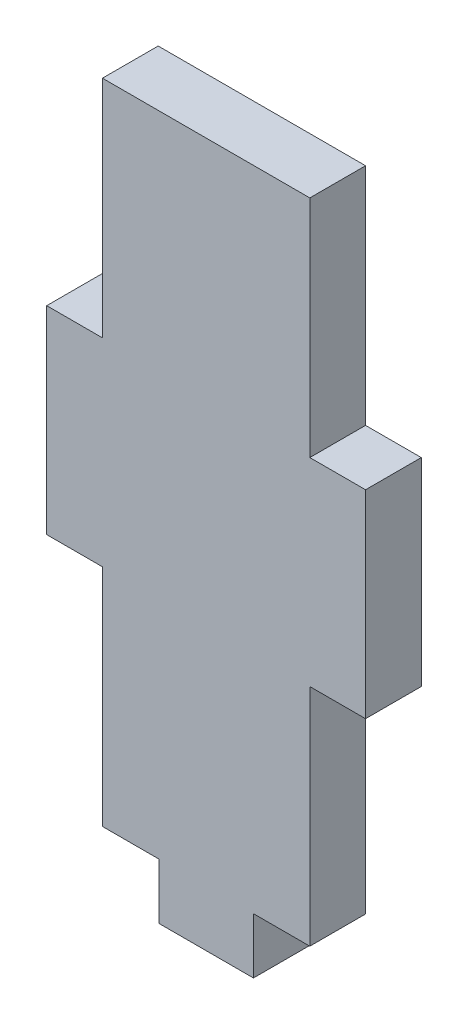
ISO-10303-21;
HEADER;
FILE_DESCRIPTION(('STEP AP214'),'2;1');
FILE_NAME('part.step','',(''),(''),'','','');
FILE_SCHEMA(('AUTOMOTIVE_DESIGN { 1 0 10303 214 1 1 1 1 }'));
ENDSEC;
DATA;
#1=APPLICATION_CONTEXT('core data for automotive mechanical design processes');
#2=APPLICATION_PROTOCOL_DEFINITION('international standard','automotive_design',2000,#1);
#3=PRODUCT_CONTEXT('',#1,'mechanical');
#4=PRODUCT('Part','Part','',(#3));
#5=PRODUCT_RELATED_PRODUCT_CATEGORY('part','',(#4));
#6=PRODUCT_DEFINITION_FORMATION('','',#4);
#7=PRODUCT_DEFINITION_CONTEXT('part definition',#1,'design');
#8=PRODUCT_DEFINITION('design','',#6,#7);
#9=PRODUCT_DEFINITION_SHAPE('','',#8);
#10=(LENGTH_UNIT() NAMED_UNIT(*) SI_UNIT(.MILLI.,.METRE.));
#11=(NAMED_UNIT(*) PLANE_ANGLE_UNIT() SI_UNIT($,.RADIAN.));
#12=(NAMED_UNIT(*) SI_UNIT($,.STERADIAN.) SOLID_ANGLE_UNIT());
#13=UNCERTAINTY_MEASURE_WITH_UNIT(LENGTH_MEASURE(1.E-05),#10,'distance_accuracy_value','');
#14=(GEOMETRIC_REPRESENTATION_CONTEXT(3) GLOBAL_UNCERTAINTY_ASSIGNED_CONTEXT((#13)) GLOBAL_UNIT_ASSIGNED_CONTEXT((#10,
#11,#12)) REPRESENTATION_CONTEXT('',''));
#15=CARTESIAN_POINT('',(0.,0.,0.));
#16=DIRECTION('',(0.,0.,1.));
#17=DIRECTION('',(1.,0.,0.));
#18=AXIS2_PLACEMENT_3D('',#15,#16,#17);
#19=CARTESIAN_POINT('',(-8.,25.,4.3));
#20=DIRECTION('',(0.,-1.,0.));
#21=DIRECTION('',(0.,0.,-1.));
#22=AXIS2_PLACEMENT_3D('',#19,#20,#21);
#23=PLANE('',#22);
#24=DIRECTION('',(-1.,0.,0.));
#25=VECTOR('',#24,1.);
#26=CARTESIAN_POINT('',(-8.,25.,0.));
#27=LINE('',#26,#25);
#28=CARTESIAN_POINT('',(8.,25.,0.));
#29=VERTEX_POINT('',#28);
#30=CARTESIAN_POINT('',(-8.,25.,0.));
#31=VERTEX_POINT('',#30);
#32=EDGE_CURVE('E180',#29,#31,#27,.T.);
#33=ORIENTED_EDGE('',*,*,#32,.T.);
#34=DIRECTION('',(0.,0.,-1.));
#35=VECTOR('',#34,1.);
#36=CARTESIAN_POINT('',(-8.,25.,4.3));
#37=LINE('',#36,#35);
#38=CARTESIAN_POINT('',(-8.,25.,4.3));
#39=VERTEX_POINT('',#38);
#40=EDGE_CURVE('E11',#39,#31,#37,.T.);
#41=ORIENTED_EDGE('',*,*,#40,.F.);
#42=DIRECTION('',(-1.,0.,0.));
#43=VECTOR('',#42,1.);
#44=CARTESIAN_POINT('',(-8.,25.,4.3));
#45=LINE('',#44,#43);
#46=CARTESIAN_POINT('',(8.,25.,4.3));
#47=VERTEX_POINT('',#46);
#48=EDGE_CURVE('E210',#47,#39,#45,.T.);
#49=ORIENTED_EDGE('',*,*,#48,.F.);
#50=DIRECTION('',(0.,0.,-1.));
#51=VECTOR('',#50,1.);
#52=CARTESIAN_POINT('',(8.,25.,4.3));
#53=LINE('',#52,#51);
#54=EDGE_CURVE('E176',#47,#29,#53,.T.);
#55=ORIENTED_EDGE('',*,*,#54,.T.);
#56=EDGE_LOOP('',(#33,#41,#49,#55));
#57=FACE_BOUND('',#56,.T.);
#58=ADVANCED_FACE('F36',(#57),#23,.F.);
#59=CARTESIAN_POINT('',(-8.,7.65,4.3));
#60=DIRECTION('',(1.,0.,0.));
#61=DIRECTION('',(0.,1.,0.));
#62=AXIS2_PLACEMENT_3D('',#59,#60,#61);
#63=PLANE('',#62);
#64=DIRECTION('',(0.,-1.,0.));
#65=VECTOR('',#64,1.);
#66=CARTESIAN_POINT('',(-8.,7.65,0.));
#67=LINE('',#66,#65);
#68=CARTESIAN_POINT('',(-8.,7.65,0.));
#69=VERTEX_POINT('',#68);
#70=EDGE_CURVE('E183',#31,#69,#67,.T.);
#71=ORIENTED_EDGE('',*,*,#70,.T.);
#72=DIRECTION('',(0.,0.,-1.));
#73=VECTOR('',#72,1.);
#74=CARTESIAN_POINT('',(-8.,7.65,4.3));
#75=LINE('',#74,#73);
#76=CARTESIAN_POINT('',(-8.,7.65,4.3));
#77=VERTEX_POINT('',#76);
#78=EDGE_CURVE('E44',#77,#69,#75,.T.);
#79=ORIENTED_EDGE('',*,*,#78,.F.);
#80=DIRECTION('',(0.,-1.,0.));
#81=VECTOR('',#80,1.);
#82=CARTESIAN_POINT('',(-8.,7.65,4.3));
#83=LINE('',#82,#81);
#84=EDGE_CURVE('E119',#39,#77,#83,.T.);
#85=ORIENTED_EDGE('',*,*,#84,.F.);
#86=ORIENTED_EDGE('',*,*,#40,.T.);
#87=EDGE_LOOP('',(#71,#79,#85,#86));
#88=FACE_BOUND('',#87,.T.);
#89=ADVANCED_FACE('F308',(#88),#63,.F.);
#90=CARTESIAN_POINT('',(-8.,7.65,4.3));
#91=DIRECTION('',(0.,-1.,0.));
#92=DIRECTION('',(0.,0.,-1.));
#93=AXIS2_PLACEMENT_3D('',#90,#91,#92);
#94=PLANE('',#93);
#95=DIRECTION('',(-1.,0.,0.));
#96=VECTOR('',#95,1.);
#97=CARTESIAN_POINT('',(-8.,7.65,0.));
#98=LINE('',#97,#96);
#99=CARTESIAN_POINT('',(-12.3,7.65,0.));
#100=VERTEX_POINT('',#99);
#101=EDGE_CURVE('E185',#69,#100,#98,.T.);
#102=ORIENTED_EDGE('',*,*,#101,.T.);
#103=DIRECTION('',(0.,0.,-1.));
#104=VECTOR('',#103,1.);
#105=CARTESIAN_POINT('',(-12.3,7.65,4.3));
#106=LINE('',#105,#104);
#107=CARTESIAN_POINT('',(-12.3,7.65,4.3));
#108=VERTEX_POINT('',#107);
#109=EDGE_CURVE('E241',#108,#100,#106,.T.);
#110=ORIENTED_EDGE('',*,*,#109,.F.);
#111=DIRECTION('',(-1.,0.,0.));
#112=VECTOR('',#111,1.);
#113=CARTESIAN_POINT('',(-8.,7.65,4.3));
#114=LINE('',#113,#112);
#115=EDGE_CURVE('E249',#77,#108,#114,.T.);
#116=ORIENTED_EDGE('',*,*,#115,.F.);
#117=ORIENTED_EDGE('',*,*,#78,.T.);
#118=EDGE_LOOP('',(#102,#110,#116,#117));
#119=FACE_BOUND('',#118,.T.);
#120=ADVANCED_FACE('F247',(#119),#94,.F.);
#121=CARTESIAN_POINT('',(-12.3,-7.65,4.3));
#122=DIRECTION('',(1.,0.,0.));
#123=DIRECTION('',(0.,0.,-1.));
#124=AXIS2_PLACEMENT_3D('',#121,#122,#123);
#125=PLANE('',#124);
#126=DIRECTION('',(0.,-1.,0.));
#127=VECTOR('',#126,1.);
#128=CARTESIAN_POINT('',(-12.3,-7.65,0.));
#129=LINE('',#128,#127);
#130=CARTESIAN_POINT('',(-12.3,-7.65,0.));
#131=VERTEX_POINT('',#130);
#132=EDGE_CURVE('E187',#100,#131,#129,.T.);
#133=ORIENTED_EDGE('',*,*,#132,.T.);
#134=DIRECTION('',(0.,0.,-1.));
#135=VECTOR('',#134,1.);
#136=CARTESIAN_POINT('',(-12.3,-7.65,4.3));
#137=LINE('',#136,#135);
#138=CARTESIAN_POINT('',(-12.3,-7.65,4.3));
#139=VERTEX_POINT('',#138);
#140=EDGE_CURVE('E238',#139,#131,#137,.T.);
#141=ORIENTED_EDGE('',*,*,#140,.F.);
#142=DIRECTION('',(0.,-1.,0.));
#143=VECTOR('',#142,1.);
#144=CARTESIAN_POINT('',(-12.3,-7.65,4.3));
#145=LINE('',#144,#143);
#146=EDGE_CURVE('E267',#108,#139,#145,.T.);
#147=ORIENTED_EDGE('',*,*,#146,.F.);
#148=ORIENTED_EDGE('',*,*,#109,.T.);
#149=EDGE_LOOP('',(#133,#141,#147,#148));
#150=FACE_BOUND('',#149,.T.);
#151=ADVANCED_FACE('F258',(#150),#125,.F.);
#152=CARTESIAN_POINT('',(-8.,-7.65,4.3));
#153=DIRECTION('',(0.,1.,0.));
#154=DIRECTION('',(0.,0.,1.));
#155=AXIS2_PLACEMENT_3D('',#152,#153,#154);
#156=PLANE('',#155);
#157=DIRECTION('',(1.,0.,0.));
#158=VECTOR('',#157,1.);
#159=CARTESIAN_POINT('',(-8.,-7.65,0.));
#160=LINE('',#159,#158);
#161=CARTESIAN_POINT('',(-8.,-7.65,0.));
#162=VERTEX_POINT('',#161);
#163=EDGE_CURVE('E189',#131,#162,#160,.T.);
#164=ORIENTED_EDGE('',*,*,#163,.T.);
#165=DIRECTION('',(0.,0.,-1.));
#166=VECTOR('',#165,1.);
#167=CARTESIAN_POINT('',(-8.,-7.65,4.3));
#168=LINE('',#167,#166);
#169=CARTESIAN_POINT('',(-8.,-7.65,4.3));
#170=VERTEX_POINT('',#169);
#171=EDGE_CURVE('E235',#170,#162,#168,.T.);
#172=ORIENTED_EDGE('',*,*,#171,.F.);
#173=DIRECTION('',(1.,0.,0.));
#174=VECTOR('',#173,1.);
#175=CARTESIAN_POINT('',(-8.,-7.65,4.3));
#176=LINE('',#175,#174);
#177=EDGE_CURVE('E264',#139,#170,#176,.T.);
#178=ORIENTED_EDGE('',*,*,#177,.F.);
#179=ORIENTED_EDGE('',*,*,#140,.T.);
#180=EDGE_LOOP('',(#164,#172,#178,#179));
#181=FACE_BOUND('',#180,.T.);
#182=ADVANCED_FACE('F262',(#181),#156,.F.);
#183=CARTESIAN_POINT('',(-8.,-25.,4.3));
#184=DIRECTION('',(1.,0.,0.));
#185=DIRECTION('',(0.,1.,0.));
#186=AXIS2_PLACEMENT_3D('',#183,#184,#185);
#187=PLANE('',#186);
#188=DIRECTION('',(0.,-1.,0.));
#189=VECTOR('',#188,1.);
#190=CARTESIAN_POINT('',(-8.,-25.,0.));
#191=LINE('',#190,#189);
#192=CARTESIAN_POINT('',(-8.,-25.,0.));
#193=VERTEX_POINT('',#192);
#194=EDGE_CURVE('E191',#162,#193,#191,.T.);
#195=ORIENTED_EDGE('',*,*,#194,.T.);
#196=DIRECTION('',(0.,0.,-1.));
#197=VECTOR('',#196,1.);
#198=CARTESIAN_POINT('',(-8.,-25.,4.3));
#199=LINE('',#198,#197);
#200=CARTESIAN_POINT('',(-8.,-25.,4.3));
#201=VERTEX_POINT('',#200);
#202=EDGE_CURVE('E232',#201,#193,#199,.T.);
#203=ORIENTED_EDGE('',*,*,#202,.F.);
#204=DIRECTION('',(0.,-1.,0.));
#205=VECTOR('',#204,1.);
#206=CARTESIAN_POINT('',(-8.,-25.,4.3));
#207=LINE('',#206,#205);
#208=EDGE_CURVE('E266',#170,#201,#207,.T.);
#209=ORIENTED_EDGE('',*,*,#208,.F.);
#210=ORIENTED_EDGE('',*,*,#171,.T.);
#211=EDGE_LOOP('',(#195,#203,#209,#210));
#212=FACE_BOUND('',#211,.T.);
#213=ADVANCED_FACE('F321',(#212),#187,.F.);
#214=CARTESIAN_POINT('',(-8.,-25.,4.3));
#215=DIRECTION('',(0.,1.,0.));
#216=DIRECTION('',(-1.,0.,0.));
#217=AXIS2_PLACEMENT_3D('',#214,#215,#216);
#218=PLANE('',#217);
#219=DIRECTION('',(1.,0.,0.));
#220=VECTOR('',#219,1.);
#221=CARTESIAN_POINT('',(-8.,-25.,0.));
#222=LINE('',#221,#220);
#223=CARTESIAN_POINT('',(-3.65,-25.,0.));
#224=VERTEX_POINT('',#223);
#225=EDGE_CURVE('E193',#193,#224,#222,.T.);
#226=ORIENTED_EDGE('',*,*,#225,.T.);
#227=DIRECTION('',(0.,0.,-1.));
#228=VECTOR('',#227,1.);
#229=CARTESIAN_POINT('',(-3.65,-25.,4.3));
#230=LINE('',#229,#228);
#231=CARTESIAN_POINT('',(-3.65,-25.,4.3));
#232=VERTEX_POINT('',#231);
#233=EDGE_CURVE('E229',#232,#224,#230,.T.);
#234=ORIENTED_EDGE('',*,*,#233,.F.);
#235=DIRECTION('',(1.,0.,0.));
#236=VECTOR('',#235,1.);
#237=CARTESIAN_POINT('',(-8.,-25.,4.3));
#238=LINE('',#237,#236);
#239=EDGE_CURVE('E269',#201,#232,#238,.T.);
#240=ORIENTED_EDGE('',*,*,#239,.F.);
#241=ORIENTED_EDGE('',*,*,#202,.T.);
#242=EDGE_LOOP('',(#226,#234,#240,#241));
#243=FACE_BOUND('',#242,.T.);
#244=ADVANCED_FACE('F324',(#243),#218,.F.);
#245=CARTESIAN_POINT('',(-3.65,-25.,4.3));
#246=DIRECTION('',(1.,0.,0.));
#247=DIRECTION('',(0.,1.,0.));
#248=AXIS2_PLACEMENT_3D('',#245,#246,#247);
#249=PLANE('',#248);
#250=DIRECTION('',(0.,-1.,0.));
#251=VECTOR('',#250,1.);
#252=CARTESIAN_POINT('',(-3.65,-25.,0.));
#253=LINE('',#252,#251);
#254=CARTESIAN_POINT('',(-3.65,-29.3,0.));
#255=VERTEX_POINT('',#254);
#256=EDGE_CURVE('E195',#224,#255,#253,.T.);
#257=ORIENTED_EDGE('',*,*,#256,.T.);
#258=DIRECTION('',(0.,0.,-1.));
#259=VECTOR('',#258,1.);
#260=CARTESIAN_POINT('',(-3.65,-29.3,4.3));
#261=LINE('',#260,#259);
#262=CARTESIAN_POINT('',(-3.65,-29.3,4.3));
#263=VERTEX_POINT('',#262);
#264=EDGE_CURVE('E226',#263,#255,#261,.T.);
#265=ORIENTED_EDGE('',*,*,#264,.F.);
#266=DIRECTION('',(0.,-1.,0.));
#267=VECTOR('',#266,1.);
#268=CARTESIAN_POINT('',(-3.65,-25.,4.3));
#269=LINE('',#268,#267);
#270=EDGE_CURVE('E275',#232,#263,#269,.T.);
#271=ORIENTED_EDGE('',*,*,#270,.F.);
#272=ORIENTED_EDGE('',*,*,#233,.T.);
#273=EDGE_LOOP('',(#257,#265,#271,#272));
#274=FACE_BOUND('',#273,.T.);
#275=ADVANCED_FACE('F328',(#274),#249,.F.);
#276=CARTESIAN_POINT('',(-3.65,-29.3,4.3));
#277=DIRECTION('',(0.,1.,0.));
#278=DIRECTION('',(0.,0.,1.));
#279=AXIS2_PLACEMENT_3D('',#276,#277,#278);
#280=PLANE('',#279);
#281=DIRECTION('',(1.,0.,0.));
#282=VECTOR('',#281,1.);
#283=CARTESIAN_POINT('',(-3.65,-29.3,0.));
#284=LINE('',#283,#282);
#285=CARTESIAN_POINT('',(3.65,-29.3,0.));
#286=VERTEX_POINT('',#285);
#287=EDGE_CURVE('E197',#255,#286,#284,.T.);
#288=ORIENTED_EDGE('',*,*,#287,.T.);
#289=DIRECTION('',(0.,0.,-1.));
#290=VECTOR('',#289,1.);
#291=CARTESIAN_POINT('',(3.65,-29.3,4.3));
#292=LINE('',#291,#290);
#293=CARTESIAN_POINT('',(3.65,-29.3,4.3));
#294=VERTEX_POINT('',#293);
#295=EDGE_CURVE('E223',#294,#286,#292,.T.);
#296=ORIENTED_EDGE('',*,*,#295,.F.);
#297=DIRECTION('',(1.,0.,0.));
#298=VECTOR('',#297,1.);
#299=CARTESIAN_POINT('',(-3.65,-29.3,4.3));
#300=LINE('',#299,#298);
#301=EDGE_CURVE('E277',#263,#294,#300,.T.);
#302=ORIENTED_EDGE('',*,*,#301,.F.);
#303=ORIENTED_EDGE('',*,*,#264,.T.);
#304=EDGE_LOOP('',(#288,#296,#302,#303));
#305=FACE_BOUND('',#304,.T.);
#306=ADVANCED_FACE('F332',(#305),#280,.F.);
#307=CARTESIAN_POINT('',(3.65,-25.,4.3));
#308=DIRECTION('',(-1.,0.,0.));
#309=DIRECTION('',(0.,-1.,0.));
#310=AXIS2_PLACEMENT_3D('',#307,#308,#309);
#311=PLANE('',#310);
#312=DIRECTION('',(0.,1.,0.));
#313=VECTOR('',#312,1.);
#314=CARTESIAN_POINT('',(3.65,-25.,0.));
#315=LINE('',#314,#313);
#316=CARTESIAN_POINT('',(3.65,-25.,0.));
#317=VERTEX_POINT('',#316);
#318=EDGE_CURVE('E199',#286,#317,#315,.T.);
#319=ORIENTED_EDGE('',*,*,#318,.T.);
#320=DIRECTION('',(0.,0.,-1.));
#321=VECTOR('',#320,1.);
#322=CARTESIAN_POINT('',(3.65,-25.,4.3));
#323=LINE('',#322,#321);
#324=CARTESIAN_POINT('',(3.65,-25.,4.3));
#325=VERTEX_POINT('',#324);
#326=EDGE_CURVE('E220',#325,#317,#323,.T.);
#327=ORIENTED_EDGE('',*,*,#326,.F.);
#328=DIRECTION('',(0.,1.,0.));
#329=VECTOR('',#328,1.);
#330=CARTESIAN_POINT('',(3.65,-25.,4.3));
#331=LINE('',#330,#329);
#332=EDGE_CURVE('E279',#294,#325,#331,.T.);
#333=ORIENTED_EDGE('',*,*,#332,.F.);
#334=ORIENTED_EDGE('',*,*,#295,.T.);
#335=EDGE_LOOP('',(#319,#327,#333,#334));
#336=FACE_BOUND('',#335,.T.);
#337=ADVANCED_FACE('F336',(#336),#311,.F.);
#338=CARTESIAN_POINT('',(3.65,-25.,4.3));
#339=DIRECTION('',(0.,1.,0.));
#340=DIRECTION('',(-1.,0.,0.));
#341=AXIS2_PLACEMENT_3D('',#338,#339,#340);
#342=PLANE('',#341);
#343=DIRECTION('',(1.,0.,0.));
#344=VECTOR('',#343,1.);
#345=CARTESIAN_POINT('',(3.65,-25.,0.));
#346=LINE('',#345,#344);
#347=CARTESIAN_POINT('',(8.,-25.,0.));
#348=VERTEX_POINT('',#347);
#349=EDGE_CURVE('E201',#317,#348,#346,.T.);
#350=ORIENTED_EDGE('',*,*,#349,.T.);
#351=DIRECTION('',(0.,0.,-1.));
#352=VECTOR('',#351,1.);
#353=CARTESIAN_POINT('',(8.,-25.,4.3));
#354=LINE('',#353,#352);
#355=CARTESIAN_POINT('',(8.,-25.,4.3));
#356=VERTEX_POINT('',#355);
#357=EDGE_CURVE('E217',#356,#348,#354,.T.);
#358=ORIENTED_EDGE('',*,*,#357,.F.);
#359=DIRECTION('',(1.,0.,0.));
#360=VECTOR('',#359,1.);
#361=CARTESIAN_POINT('',(3.65,-25.,4.3));
#362=LINE('',#361,#360);
#363=EDGE_CURVE('E281',#325,#356,#362,.T.);
#364=ORIENTED_EDGE('',*,*,#363,.F.);
#365=ORIENTED_EDGE('',*,*,#326,.T.);
#366=EDGE_LOOP('',(#350,#358,#364,#365));
#367=FACE_BOUND('',#366,.T.);
#368=ADVANCED_FACE('F340',(#367),#342,.F.);
#369=CARTESIAN_POINT('',(8.,-25.,4.3));
#370=DIRECTION('',(-1.,0.,0.));
#371=DIRECTION('',(0.,-1.,0.));
#372=AXIS2_PLACEMENT_3D('',#369,#370,#371);
#373=PLANE('',#372);
#374=DIRECTION('',(0.,1.,0.));
#375=VECTOR('',#374,1.);
#376=CARTESIAN_POINT('',(8.,-25.,0.));
#377=LINE('',#376,#375);
#378=CARTESIAN_POINT('',(8.,-7.65,0.));
#379=VERTEX_POINT('',#378);
#380=EDGE_CURVE('E203',#348,#379,#377,.T.);
#381=ORIENTED_EDGE('',*,*,#380,.T.);
#382=DIRECTION('',(0.,0.,-1.));
#383=VECTOR('',#382,1.);
#384=CARTESIAN_POINT('',(8.,-7.65,4.3));
#385=LINE('',#384,#383);
#386=CARTESIAN_POINT('',(8.,-7.65,4.3));
#387=VERTEX_POINT('',#386);
#388=EDGE_CURVE('E214',#387,#379,#385,.T.);
#389=ORIENTED_EDGE('',*,*,#388,.F.);
#390=DIRECTION('',(0.,1.,0.));
#391=VECTOR('',#390,1.);
#392=CARTESIAN_POINT('',(8.,-25.,4.3));
#393=LINE('',#392,#391);
#394=EDGE_CURVE('E283',#356,#387,#393,.T.);
#395=ORIENTED_EDGE('',*,*,#394,.F.);
#396=ORIENTED_EDGE('',*,*,#357,.T.);
#397=EDGE_LOOP('',(#381,#389,#395,#396));
#398=FACE_BOUND('',#397,.T.);
#399=ADVANCED_FACE('F289',(#398),#373,.F.);
#400=CARTESIAN_POINT('',(8.,-7.65,4.3));
#401=DIRECTION('',(0.,1.,0.));
#402=DIRECTION('',(0.,0.,1.));
#403=AXIS2_PLACEMENT_3D('',#400,#401,#402);
#404=PLANE('',#403);
#405=DIRECTION('',(1.,0.,0.));
#406=VECTOR('',#405,1.);
#407=CARTESIAN_POINT('',(8.,-7.65,0.));
#408=LINE('',#407,#406);
#409=CARTESIAN_POINT('',(12.3,-7.65,0.));
#410=VERTEX_POINT('',#409);
#411=EDGE_CURVE('E205',#379,#410,#408,.T.);
#412=ORIENTED_EDGE('',*,*,#411,.T.);
#413=DIRECTION('',(0.,0.,-1.));
#414=VECTOR('',#413,1.);
#415=CARTESIAN_POINT('',(12.3,-7.65,4.3));
#416=LINE('',#415,#414);
#417=CARTESIAN_POINT('',(12.3,-7.65,4.3));
#418=VERTEX_POINT('',#417);
#419=EDGE_CURVE('E171',#418,#410,#416,.T.);
#420=ORIENTED_EDGE('',*,*,#419,.F.);
#421=DIRECTION('',(1.,0.,0.));
#422=VECTOR('',#421,1.);
#423=CARTESIAN_POINT('',(8.,-7.65,4.3));
#424=LINE('',#423,#422);
#425=EDGE_CURVE('E162',#387,#418,#424,.T.);
#426=ORIENTED_EDGE('',*,*,#425,.F.);
#427=ORIENTED_EDGE('',*,*,#388,.T.);
#428=EDGE_LOOP('',(#412,#420,#426,#427));
#429=FACE_BOUND('',#428,.T.);
#430=ADVANCED_FACE('F293',(#429),#404,.F.);
#431=CARTESIAN_POINT('',(12.3,-7.65,4.3));
#432=DIRECTION('',(-1.,0.,0.));
#433=DIRECTION('',(0.,0.,1.));
#434=AXIS2_PLACEMENT_3D('',#431,#432,#433);
#435=PLANE('',#434);
#436=DIRECTION('',(0.,1.,0.));
#437=VECTOR('',#436,1.);
#438=CARTESIAN_POINT('',(12.3,-7.65,0.));
#439=LINE('',#438,#437);
#440=CARTESIAN_POINT('',(12.3,7.65,0.));
#441=VERTEX_POINT('',#440);
#442=EDGE_CURVE('E170',#410,#441,#439,.T.);
#443=ORIENTED_EDGE('',*,*,#442,.T.);
#444=DIRECTION('',(0.,0.,-1.));
#445=VECTOR('',#444,1.);
#446=CARTESIAN_POINT('',(12.3,7.65,4.3));
#447=LINE('',#446,#445);
#448=CARTESIAN_POINT('',(12.3,7.65,4.3));
#449=VERTEX_POINT('',#448);
#450=EDGE_CURVE('E167',#449,#441,#447,.T.);
#451=ORIENTED_EDGE('',*,*,#450,.F.);
#452=DIRECTION('',(0.,1.,0.));
#453=VECTOR('',#452,1.);
#454=CARTESIAN_POINT('',(12.3,-7.65,4.3));
#455=LINE('',#454,#453);
#456=EDGE_CURVE('E156',#418,#449,#455,.T.);
#457=ORIENTED_EDGE('',*,*,#456,.F.);
#458=ORIENTED_EDGE('',*,*,#419,.T.);
#459=EDGE_LOOP('',(#443,#451,#457,#458));
#460=FACE_BOUND('',#459,.T.);
#461=ADVANCED_FACE('F168',(#460),#435,.F.);
#462=CARTESIAN_POINT('',(8.,7.65,4.3));
#463=DIRECTION('',(0.,-1.,0.));
#464=DIRECTION('',(0.,0.,-1.));
#465=AXIS2_PLACEMENT_3D('',#462,#463,#464);
#466=PLANE('',#465);
#467=DIRECTION('',(-1.,0.,0.));
#468=VECTOR('',#467,1.);
#469=CARTESIAN_POINT('',(8.,7.65,0.));
#470=LINE('',#469,#468);
#471=CARTESIAN_POINT('',(8.,7.65,0.));
#472=VERTEX_POINT('',#471);
#473=EDGE_CURVE('E105',#441,#472,#470,.T.);
#474=ORIENTED_EDGE('',*,*,#473,.T.);
#475=DIRECTION('',(0.,0.,-1.));
#476=VECTOR('',#475,1.);
#477=CARTESIAN_POINT('',(8.,7.65,4.3));
#478=LINE('',#477,#476);
#479=CARTESIAN_POINT('',(8.,7.65,4.3));
#480=VERTEX_POINT('',#479);
#481=EDGE_CURVE('E172',#480,#472,#478,.T.);
#482=ORIENTED_EDGE('',*,*,#481,.F.);
#483=DIRECTION('',(-1.,0.,0.));
#484=VECTOR('',#483,1.);
#485=CARTESIAN_POINT('',(8.,7.65,4.3));
#486=LINE('',#485,#484);
#487=EDGE_CURVE('E160',#449,#480,#486,.T.);
#488=ORIENTED_EDGE('',*,*,#487,.F.);
#489=ORIENTED_EDGE('',*,*,#450,.T.);
#490=EDGE_LOOP('',(#474,#482,#488,#489));
#491=FACE_BOUND('',#490,.T.);
#492=ADVANCED_FACE('F174',(#491),#466,.F.);
#493=CARTESIAN_POINT('',(8.,7.65,4.3));
#494=DIRECTION('',(-1.,0.,0.));
#495=DIRECTION('',(0.,-1.,0.));
#496=AXIS2_PLACEMENT_3D('',#493,#494,#495);
#497=PLANE('',#496);
#498=DIRECTION('',(0.,1.,0.));
#499=VECTOR('',#498,1.);
#500=CARTESIAN_POINT('',(8.,7.65,0.));
#501=LINE('',#500,#499);
#502=EDGE_CURVE('E111',#472,#29,#501,.T.);
#503=ORIENTED_EDGE('',*,*,#502,.T.);
#504=ORIENTED_EDGE('',*,*,#54,.F.);
#505=DIRECTION('',(0.,1.,0.));
#506=VECTOR('',#505,1.);
#507=CARTESIAN_POINT('',(8.,7.65,4.3));
#508=LINE('',#507,#506);
#509=EDGE_CURVE('E52',#480,#47,#508,.T.);
#510=ORIENTED_EDGE('',*,*,#509,.F.);
#511=ORIENTED_EDGE('',*,*,#481,.T.);
#512=EDGE_LOOP('',(#503,#504,#510,#511));
#513=FACE_BOUND('',#512,.T.);
#514=ADVANCED_FACE('F297',(#513),#497,.F.);
#515=CARTESIAN_POINT('',(0.,0.,4.3));
#516=DIRECTION('',(0.,0.,1.));
#517=DIRECTION('',(1.,0.,0.));
#518=AXIS2_PLACEMENT_3D('',#515,#516,#517);
#519=PLANE('',#518);
#520=ORIENTED_EDGE('',*,*,#48,.T.);
#521=ORIENTED_EDGE('',*,*,#84,.T.);
#522=ORIENTED_EDGE('',*,*,#115,.T.);
#523=ORIENTED_EDGE('',*,*,#146,.T.);
#524=ORIENTED_EDGE('',*,*,#177,.T.);
#525=ORIENTED_EDGE('',*,*,#208,.T.);
#526=ORIENTED_EDGE('',*,*,#239,.T.);
#527=ORIENTED_EDGE('',*,*,#270,.T.);
#528=ORIENTED_EDGE('',*,*,#301,.T.);
#529=ORIENTED_EDGE('',*,*,#332,.T.);
#530=ORIENTED_EDGE('',*,*,#363,.T.);
#531=ORIENTED_EDGE('',*,*,#394,.T.);
#532=ORIENTED_EDGE('',*,*,#425,.T.);
#533=ORIENTED_EDGE('',*,*,#456,.T.);
#534=ORIENTED_EDGE('',*,*,#487,.T.);
#535=ORIENTED_EDGE('',*,*,#509,.T.);
#536=EDGE_LOOP('',(#520,#521,#522,#523,#524,#525,#526,#527,#528,#529,#530,#531,#532,#533,#534,#535));
#537=FACE_BOUND('',#536,.T.);
#538=ADVANCED_FACE('F158',(#537),#519,.T.);
#539=CARTESIAN_POINT('',(0.,0.,0.));
#540=DIRECTION('',(0.,0.,1.));
#541=DIRECTION('',(1.,0.,0.));
#542=AXIS2_PLACEMENT_3D('',#539,#540,#541);
#543=PLANE('',#542);
#544=ORIENTED_EDGE('',*,*,#32,.F.);
#545=ORIENTED_EDGE('',*,*,#502,.F.);
#546=ORIENTED_EDGE('',*,*,#473,.F.);
#547=ORIENTED_EDGE('',*,*,#442,.F.);
#548=ORIENTED_EDGE('',*,*,#411,.F.);
#549=ORIENTED_EDGE('',*,*,#380,.F.);
#550=ORIENTED_EDGE('',*,*,#349,.F.);
#551=ORIENTED_EDGE('',*,*,#318,.F.);
#552=ORIENTED_EDGE('',*,*,#287,.F.);
#553=ORIENTED_EDGE('',*,*,#256,.F.);
#554=ORIENTED_EDGE('',*,*,#225,.F.);
#555=ORIENTED_EDGE('',*,*,#194,.F.);
#556=ORIENTED_EDGE('',*,*,#163,.F.);
#557=ORIENTED_EDGE('',*,*,#132,.F.);
#558=ORIENTED_EDGE('',*,*,#101,.F.);
#559=ORIENTED_EDGE('',*,*,#70,.F.);
#560=EDGE_LOOP('',(#544,#545,#546,#547,#548,#549,#550,#551,#552,#553,#554,#555,#556,#557,#558,#559));
#561=FACE_BOUND('',#560,.T.);
#562=ADVANCED_FACE('F253',(#561),#543,.F.);
#563=CLOSED_SHELL('',(#58,#89,#120,#151,#182,#213,#244,#275,#306,#337,#368,#399,#430,#461,#492,
#514,#538,#562));
#564=MANIFOLD_SOLID_BREP('B2',#563);
#565=ADVANCED_BREP_SHAPE_REPRESENTATION('',(#18,#564),#14);
#566=SHAPE_DEFINITION_REPRESENTATION(#9,#565);
ENDSEC;
END-ISO-10303-21;
